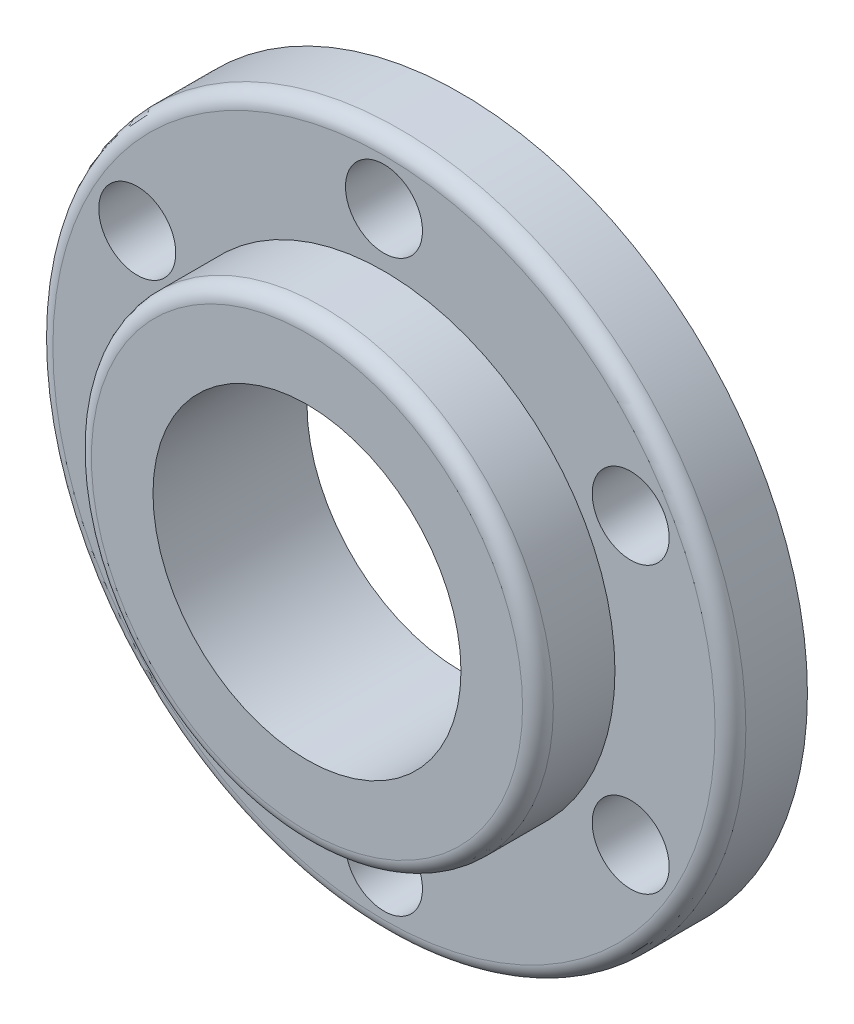
ISO-10303-21;
HEADER;
FILE_DESCRIPTION(('STEP AP214'),'2;1');
FILE_NAME('part.step','',(''),(''),'','','');
FILE_SCHEMA(('AUTOMOTIVE_DESIGN { 1 0 10303 214 1 1 1 1 }'));
ENDSEC;
DATA;
#1=APPLICATION_CONTEXT('core data for automotive mechanical design processes');
#2=APPLICATION_PROTOCOL_DEFINITION('international standard','automotive_design',2000,#1);
#3=PRODUCT_CONTEXT('',#1,'mechanical');
#4=PRODUCT('Part','Part','',(#3));
#5=PRODUCT_RELATED_PRODUCT_CATEGORY('part','',(#4));
#6=PRODUCT_DEFINITION_FORMATION('','',#4);
#7=PRODUCT_DEFINITION_CONTEXT('part definition',#1,'design');
#8=PRODUCT_DEFINITION('design','',#6,#7);
#9=PRODUCT_DEFINITION_SHAPE('','',#8);
#10=(LENGTH_UNIT() NAMED_UNIT(*) SI_UNIT(.MILLI.,.METRE.));
#11=(NAMED_UNIT(*) PLANE_ANGLE_UNIT() SI_UNIT($,.RADIAN.));
#12=(NAMED_UNIT(*) SI_UNIT($,.STERADIAN.) SOLID_ANGLE_UNIT());
#13=UNCERTAINTY_MEASURE_WITH_UNIT(LENGTH_MEASURE(1.E-05),#10,'distance_accuracy_value','');
#14=(GEOMETRIC_REPRESENTATION_CONTEXT(3) GLOBAL_UNCERTAINTY_ASSIGNED_CONTEXT((#13)) GLOBAL_UNIT_ASSIGNED_CONTEXT((#10,
#11,#12)) REPRESENTATION_CONTEXT('',''));
#15=CARTESIAN_POINT('',(0.,0.,0.));
#16=DIRECTION('',(0.,0.,1.));
#17=DIRECTION('',(1.,0.,0.));
#18=AXIS2_PLACEMENT_3D('',#15,#16,#17);
#19=CARTESIAN_POINT('',(0.,4.99740259740259,7.83134498552466));
#20=DIRECTION('',(0.,0.,-1.));
#21=DIRECTION('',(-1.,0.,0.));
#22=AXIS2_PLACEMENT_3D('',#19,#20,#21);
#23=CYLINDRICAL_SURFACE('',#22,0.675324675324676);
#24=CARTESIAN_POINT('',(0.,4.99740259740259,7.83134498552466));
#25=DIRECTION('',(0.,0.,1.));
#26=DIRECTION('',(1.,0.,0.));
#27=AXIS2_PLACEMENT_3D('',#24,#25,#26);
#28=CIRCLE('',#27,0.675324675324676);
#29=CARTESIAN_POINT('',(0.675324675324677,4.99740259740259,7.83134498552466));
#30=VERTEX_POINT('',#29);
#31=EDGE_CURVE('E60',#30,#30,#28,.T.);
#32=ORIENTED_EDGE('',*,*,#31,.T.);
#33=EDGE_LOOP('',(#32));
#34=FACE_BOUND('',#33,.T.);
#35=CARTESIAN_POINT('',(0.,4.99740259740259,6.48069563487531));
#36=DIRECTION('',(0.,0.,1.));
#37=DIRECTION('',(1.,0.,0.));
#38=AXIS2_PLACEMENT_3D('',#35,#36,#37);
#39=CIRCLE('',#38,0.675324675324676);
#40=CARTESIAN_POINT('',(0.675324675324677,4.99740259740259,6.48069563487531));
#41=VERTEX_POINT('',#40);
#42=EDGE_CURVE('E66',#41,#41,#39,.T.);
#43=ORIENTED_EDGE('',*,*,#42,.F.);
#44=EDGE_LOOP('',(#43));
#45=FACE_BOUND('',#44,.T.);
#46=ADVANCED_FACE('F36',(#34,#45),#23,.F.);
#47=CARTESIAN_POINT('',(4.327877602289,2.49870129870129,7.83134498552466));
#48=DIRECTION('',(0.,0.,-1.));
#49=DIRECTION('',(-1.,0.,0.));
#50=AXIS2_PLACEMENT_3D('',#47,#48,#49);
#51=CYLINDRICAL_SURFACE('',#50,0.675324675324675);
#52=CARTESIAN_POINT('',(4.327877602289,2.49870129870129,7.83134498552466));
#53=DIRECTION('',(0.,0.,1.));
#54=DIRECTION('',(1.,0.,0.));
#55=AXIS2_PLACEMENT_3D('',#52,#53,#54);
#56=CIRCLE('',#55,0.675324675324675);
#57=CARTESIAN_POINT('',(5.00320227761367,2.49870129870129,7.83134498552466));
#58=VERTEX_POINT('',#57);
#59=EDGE_CURVE('E94',#58,#58,#56,.T.);
#60=ORIENTED_EDGE('',*,*,#59,.T.);
#61=EDGE_LOOP('',(#60));
#62=FACE_BOUND('',#61,.T.);
#63=CARTESIAN_POINT('',(4.327877602289,2.49870129870129,6.48069563487531));
#64=DIRECTION('',(0.,0.,1.));
#65=DIRECTION('',(1.,0.,0.));
#66=AXIS2_PLACEMENT_3D('',#63,#64,#65);
#67=CIRCLE('',#66,0.675324675324675);
#68=CARTESIAN_POINT('',(5.00320227761367,2.49870129870129,6.48069563487531));
#69=VERTEX_POINT('',#68);
#70=EDGE_CURVE('E70',#69,#69,#67,.T.);
#71=ORIENTED_EDGE('',*,*,#70,.F.);
#72=EDGE_LOOP('',(#71));
#73=FACE_BOUND('',#72,.T.);
#74=ADVANCED_FACE('F140',(#62,#73),#51,.F.);
#75=CARTESIAN_POINT('',(4.32787760228898,-2.49870129870132,7.83134498552466));
#76=DIRECTION('',(0.,0.,-1.));
#77=DIRECTION('',(-1.,0.,0.));
#78=AXIS2_PLACEMENT_3D('',#75,#76,#77);
#79=CYLINDRICAL_SURFACE('',#78,0.675324675324676);
#80=CARTESIAN_POINT('',(4.32787760228898,-2.49870129870132,7.83134498552466));
#81=DIRECTION('',(0.,0.,1.));
#82=DIRECTION('',(1.,0.,0.));
#83=AXIS2_PLACEMENT_3D('',#80,#81,#82);
#84=CIRCLE('',#83,0.675324675324676);
#85=CARTESIAN_POINT('',(5.00320227761365,-2.49870129870132,7.83134498552466));
#86=VERTEX_POINT('',#85);
#87=EDGE_CURVE('E98',#86,#86,#84,.T.);
#88=ORIENTED_EDGE('',*,*,#87,.T.);
#89=EDGE_LOOP('',(#88));
#90=FACE_BOUND('',#89,.T.);
#91=CARTESIAN_POINT('',(4.32787760228898,-2.49870129870132,6.48069563487531));
#92=DIRECTION('',(0.,0.,1.));
#93=DIRECTION('',(1.,0.,0.));
#94=AXIS2_PLACEMENT_3D('',#91,#92,#93);
#95=CIRCLE('',#94,0.675324675324676);
#96=CARTESIAN_POINT('',(5.00320227761365,-2.49870129870132,6.48069563487531));
#97=VERTEX_POINT('',#96);
#98=EDGE_CURVE('E74',#97,#97,#95,.T.);
#99=ORIENTED_EDGE('',*,*,#98,.F.);
#100=EDGE_LOOP('',(#99));
#101=FACE_BOUND('',#100,.T.);
#102=ADVANCED_FACE('F146',(#90,#101),#79,.F.);
#103=CARTESIAN_POINT('',(0.,-4.9974025974026,7.83134498552466));
#104=DIRECTION('',(0.,0.,-1.));
#105=DIRECTION('',(-1.,0.,0.));
#106=AXIS2_PLACEMENT_3D('',#103,#104,#105);
#107=CYLINDRICAL_SURFACE('',#106,0.675324675324675);
#108=CARTESIAN_POINT('',(0.,-4.9974025974026,7.83134498552466));
#109=DIRECTION('',(0.,0.,1.));
#110=DIRECTION('',(1.,0.,0.));
#111=AXIS2_PLACEMENT_3D('',#108,#109,#110);
#112=CIRCLE('',#111,0.675324675324675);
#113=CARTESIAN_POINT('',(0.675324675324641,-4.9974025974026,7.83134498552466));
#114=VERTEX_POINT('',#113);
#115=EDGE_CURVE('E102',#114,#114,#112,.T.);
#116=ORIENTED_EDGE('',*,*,#115,.T.);
#117=EDGE_LOOP('',(#116));
#118=FACE_BOUND('',#117,.T.);
#119=CARTESIAN_POINT('',(0.,-4.9974025974026,6.48069563487531));
#120=DIRECTION('',(0.,0.,1.));
#121=DIRECTION('',(1.,0.,0.));
#122=AXIS2_PLACEMENT_3D('',#119,#120,#121);
#123=CIRCLE('',#122,0.675324675324675);
#124=CARTESIAN_POINT('',(0.675324675324641,-4.9974025974026,6.48069563487531));
#125=VERTEX_POINT('',#124);
#126=EDGE_CURVE('E78',#125,#125,#123,.T.);
#127=ORIENTED_EDGE('',*,*,#126,.F.);
#128=EDGE_LOOP('',(#127));
#129=FACE_BOUND('',#128,.T.);
#130=ADVANCED_FACE('F156',(#118,#129),#107,.F.);
#131=CARTESIAN_POINT('',(-4.32787760228901,-2.49870129870126,7.83134498552466));
#132=DIRECTION('',(0.,0.,-1.));
#133=DIRECTION('',(-1.,0.,0.));
#134=AXIS2_PLACEMENT_3D('',#131,#132,#133);
#135=CYLINDRICAL_SURFACE('',#134,0.675324675324675);
#136=CARTESIAN_POINT('',(-4.32787760228901,-2.49870129870126,7.83134498552466));
#137=DIRECTION('',(0.,0.,1.));
#138=DIRECTION('',(1.,0.,0.));
#139=AXIS2_PLACEMENT_3D('',#136,#137,#138);
#140=CIRCLE('',#139,0.675324675324675);
#141=CARTESIAN_POINT('',(-3.65255292696434,-2.49870129870126,7.83134498552466));
#142=VERTEX_POINT('',#141);
#143=EDGE_CURVE('E106',#142,#142,#140,.T.);
#144=ORIENTED_EDGE('',*,*,#143,.T.);
#145=EDGE_LOOP('',(#144));
#146=FACE_BOUND('',#145,.T.);
#147=CARTESIAN_POINT('',(-4.32787760228901,-2.49870129870126,6.48069563487531));
#148=DIRECTION('',(0.,0.,1.));
#149=DIRECTION('',(1.,0.,0.));
#150=AXIS2_PLACEMENT_3D('',#147,#148,#149);
#151=CIRCLE('',#150,0.675324675324675);
#152=CARTESIAN_POINT('',(-3.65255292696434,-2.49870129870126,6.48069563487531));
#153=VERTEX_POINT('',#152);
#154=EDGE_CURVE('E82',#153,#153,#151,.T.);
#155=ORIENTED_EDGE('',*,*,#154,.F.);
#156=EDGE_LOOP('',(#155));
#157=FACE_BOUND('',#156,.T.);
#158=ADVANCED_FACE('F160',(#146,#157),#135,.F.);
#159=CARTESIAN_POINT('',(-4.32787760228896,2.49870129870134,7.83134498552466));
#160=DIRECTION('',(0.,0.,-1.));
#161=DIRECTION('',(-1.,0.,0.));
#162=AXIS2_PLACEMENT_3D('',#159,#160,#161);
#163=CYLINDRICAL_SURFACE('',#162,0.675324675324675);
#164=CARTESIAN_POINT('',(-4.32787760228896,2.49870129870134,7.83134498552466));
#165=DIRECTION('',(0.,0.,1.));
#166=DIRECTION('',(1.,0.,0.));
#167=AXIS2_PLACEMENT_3D('',#164,#165,#166);
#168=CIRCLE('',#167,0.675324675324675);
#169=CARTESIAN_POINT('',(-3.65255292696428,2.49870129870134,7.83134498552466));
#170=VERTEX_POINT('',#169);
#171=EDGE_CURVE('E110',#170,#170,#168,.T.);
#172=ORIENTED_EDGE('',*,*,#171,.T.);
#173=EDGE_LOOP('',(#172));
#174=FACE_BOUND('',#173,.T.);
#175=CARTESIAN_POINT('',(-4.32787760228896,2.49870129870134,6.48069563487531));
#176=DIRECTION('',(0.,0.,1.));
#177=DIRECTION('',(1.,0.,0.));
#178=AXIS2_PLACEMENT_3D('',#175,#176,#177);
#179=CIRCLE('',#178,0.675324675324675);
#180=CARTESIAN_POINT('',(-3.65255292696428,2.49870129870134,6.48069563487531));
#181=VERTEX_POINT('',#180);
#182=EDGE_CURVE('E86',#181,#181,#179,.T.);
#183=ORIENTED_EDGE('',*,*,#182,.F.);
#184=EDGE_LOOP('',(#183));
#185=FACE_BOUND('',#184,.T.);
#186=ADVANCED_FACE('F164',(#174,#185),#163,.F.);
#187=CARTESIAN_POINT('',(0.,0.,7.83134498552466));
#188=DIRECTION('',(0.,0.,-1.));
#189=DIRECTION('',(-1.,0.,0.));
#190=AXIS2_PLACEMENT_3D('',#187,#188,#189);
#191=CYLINDRICAL_SURFACE('',#190,6.07792207792208);
#192=CARTESIAN_POINT('',(0.,0.,7.56121511539479));
#193=DIRECTION('',(0.,0.,1.));
#194=DIRECTION('',(1.,0.,0.));
#195=AXIS2_PLACEMENT_3D('',#192,#193,#194);
#196=CIRCLE('',#195,6.07792207792208);
#197=CARTESIAN_POINT('',(6.07792207792208,0.,7.56121511539479));
#198=VERTEX_POINT('',#197);
#199=EDGE_CURVE('E49',#198,#198,#196,.F.);
#200=ORIENTED_EDGE('',*,*,#199,.T.);
#201=EDGE_LOOP('',(#200));
#202=FACE_BOUND('',#201,.T.);
#203=CARTESIAN_POINT('',(0.,0.,6.48069563487531));
#204=DIRECTION('',(0.,0.,1.));
#205=DIRECTION('',(1.,0.,0.));
#206=AXIS2_PLACEMENT_3D('',#203,#204,#205);
#207=CIRCLE('',#206,6.07792207792208);
#208=CARTESIAN_POINT('',(6.07792207792208,0.,6.48069563487531));
#209=VERTEX_POINT('',#208);
#210=EDGE_CURVE('E61',#209,#209,#207,.T.);
#211=ORIENTED_EDGE('',*,*,#210,.T.);
#212=EDGE_LOOP('',(#211));
#213=FACE_BOUND('',#212,.T.);
#214=ADVANCED_FACE('F151',(#202,#213),#191,.T.);
#215=CARTESIAN_POINT('',(0.,0.,7.83134498552466));
#216=DIRECTION('',(0.,0.,1.));
#217=DIRECTION('',(1.,0.,0.));
#218=AXIS2_PLACEMENT_3D('',#215,#216,#217);
#219=PLANE('',#218);
#220=CARTESIAN_POINT('',(0.,0.,7.83134498552466));
#221=DIRECTION('',(0.,0.,1.));
#222=DIRECTION('',(1.,0.,0.));
#223=AXIS2_PLACEMENT_3D('',#220,#221,#222);
#224=CIRCLE('',#223,5.80779220779221);
#225=CARTESIAN_POINT('',(5.80779220779221,0.,7.83134498552466));
#226=VERTEX_POINT('',#225);
#227=EDGE_CURVE('E54',#226,#226,#224,.T.);
#228=ORIENTED_EDGE('',*,*,#227,.T.);
#229=EDGE_LOOP('',(#228));
#230=FACE_BOUND('',#229,.T.);
#231=CARTESIAN_POINT('',(0.,0.,7.83134498552466));
#232=DIRECTION('',(0.,0.,1.));
#233=DIRECTION('',(1.,0.,0.));
#234=AXIS2_PLACEMENT_3D('',#231,#232,#233);
#235=CIRCLE('',#234,4.05194805194805);
#236=CARTESIAN_POINT('',(4.05194805194805,0.,7.83134498552466));
#237=VERTEX_POINT('',#236);
#238=EDGE_CURVE('E65',#237,#237,#235,.T.);
#239=ORIENTED_EDGE('',*,*,#238,.F.);
#240=EDGE_LOOP('',(#239));
#241=FACE_BOUND('',#240,.T.);
#242=ORIENTED_EDGE('',*,*,#171,.F.);
#243=EDGE_LOOP('',(#242));
#244=FACE_BOUND('',#243,.T.);
#245=ORIENTED_EDGE('',*,*,#143,.F.);
#246=EDGE_LOOP('',(#245));
#247=FACE_BOUND('',#246,.T.);
#248=ORIENTED_EDGE('',*,*,#115,.F.);
#249=EDGE_LOOP('',(#248));
#250=FACE_BOUND('',#249,.T.);
#251=ORIENTED_EDGE('',*,*,#87,.F.);
#252=EDGE_LOOP('',(#251));
#253=FACE_BOUND('',#252,.T.);
#254=ORIENTED_EDGE('',*,*,#59,.F.);
#255=EDGE_LOOP('',(#254));
#256=FACE_BOUND('',#255,.T.);
#257=ORIENTED_EDGE('',*,*,#31,.F.);
#258=EDGE_LOOP('',(#257));
#259=FACE_BOUND('',#258,.T.);
#260=ADVANCED_FACE('F171',(#230,#241,#244,#247,#250,#253,#256,#259),#219,.T.);
#261=CARTESIAN_POINT('',(0.,0.,6.48069563487531));
#262=DIRECTION('',(0.,0.,1.));
#263=DIRECTION('',(1.,0.,0.));
#264=AXIS2_PLACEMENT_3D('',#261,#262,#263);
#265=PLANE('',#264);
#266=ORIENTED_EDGE('',*,*,#182,.T.);
#267=EDGE_LOOP('',(#266));
#268=FACE_BOUND('',#267,.T.);
#269=ORIENTED_EDGE('',*,*,#154,.T.);
#270=EDGE_LOOP('',(#269));
#271=FACE_BOUND('',#270,.T.);
#272=ORIENTED_EDGE('',*,*,#126,.T.);
#273=EDGE_LOOP('',(#272));
#274=FACE_BOUND('',#273,.T.);
#275=ORIENTED_EDGE('',*,*,#98,.T.);
#276=EDGE_LOOP('',(#275));
#277=FACE_BOUND('',#276,.T.);
#278=ORIENTED_EDGE('',*,*,#70,.T.);
#279=EDGE_LOOP('',(#278));
#280=FACE_BOUND('',#279,.T.);
#281=ORIENTED_EDGE('',*,*,#42,.T.);
#282=EDGE_LOOP('',(#281));
#283=FACE_BOUND('',#282,.T.);
#284=ORIENTED_EDGE('',*,*,#210,.F.);
#285=EDGE_LOOP('',(#284));
#286=FACE_BOUND('',#285,.T.);
#287=CARTESIAN_POINT('',(0.,0.,6.48069563487531));
#288=DIRECTION('',(0.,0.,1.));
#289=DIRECTION('',(1.,0.,0.));
#290=AXIS2_PLACEMENT_3D('',#287,#288,#289);
#291=CIRCLE('',#290,2.7012987012987);
#292=CARTESIAN_POINT('',(2.7012987012987,0.,6.48069563487531));
#293=VERTEX_POINT('',#292);
#294=EDGE_CURVE('E117',#293,#293,#291,.T.);
#295=ORIENTED_EDGE('',*,*,#294,.T.);
#296=EDGE_LOOP('',(#295));
#297=FACE_BOUND('',#296,.T.);
#298=ADVANCED_FACE('F177',(#268,#271,#274,#277,#280,#283,#286,#297),#265,.F.);
#299=CARTESIAN_POINT('',(0.,0.,9.18199433617401));
#300=DIRECTION('',(0.,0.,-1.));
#301=DIRECTION('',(-1.,0.,0.));
#302=AXIS2_PLACEMENT_3D('',#299,#300,#301);
#303=CYLINDRICAL_SURFACE('',#302,2.7012987012987);
#304=CARTESIAN_POINT('',(0.,0.,9.18199433617401));
#305=DIRECTION('',(0.,0.,1.));
#306=DIRECTION('',(1.,0.,0.));
#307=AXIS2_PLACEMENT_3D('',#304,#305,#306);
#308=CIRCLE('',#307,2.7012987012987);
#309=CARTESIAN_POINT('',(2.7012987012987,0.,9.18199433617401));
#310=VERTEX_POINT('',#309);
#311=EDGE_CURVE('E90',#310,#310,#308,.T.);
#312=ORIENTED_EDGE('',*,*,#311,.T.);
#313=EDGE_LOOP('',(#312));
#314=FACE_BOUND('',#313,.T.);
#315=ORIENTED_EDGE('',*,*,#294,.F.);
#316=EDGE_LOOP('',(#315));
#317=FACE_BOUND('',#316,.T.);
#318=ADVANCED_FACE('F125',(#314,#317),#303,.F.);
#319=CARTESIAN_POINT('',(0.,0.,9.18199433617401));
#320=DIRECTION('',(0.,0.,-1.));
#321=DIRECTION('',(-1.,0.,0.));
#322=AXIS2_PLACEMENT_3D('',#319,#320,#321);
#323=CYLINDRICAL_SURFACE('',#322,4.05194805194805);
#324=CARTESIAN_POINT('',(0.,0.,8.91186446604415));
#325=DIRECTION('',(0.,0.,1.));
#326=DIRECTION('',(1.,0.,0.));
#327=AXIS2_PLACEMENT_3D('',#324,#325,#326);
#328=CIRCLE('',#327,4.05194805194805);
#329=CARTESIAN_POINT('',(4.05194805194805,0.,8.91186446604415));
#330=VERTEX_POINT('',#329);
#331=EDGE_CURVE('E10',#330,#330,#328,.F.);
#332=ORIENTED_EDGE('',*,*,#331,.T.);
#333=EDGE_LOOP('',(#332));
#334=FACE_BOUND('',#333,.T.);
#335=ORIENTED_EDGE('',*,*,#238,.T.);
#336=EDGE_LOOP('',(#335));
#337=FACE_BOUND('',#336,.T.);
#338=ADVANCED_FACE('F131',(#334,#337),#323,.T.);
#339=CARTESIAN_POINT('',(0.,0.,9.18199433617401));
#340=DIRECTION('',(0.,0.,1.));
#341=DIRECTION('',(1.,0.,0.));
#342=AXIS2_PLACEMENT_3D('',#339,#340,#341);
#343=PLANE('',#342);
#344=CARTESIAN_POINT('',(0.,0.,9.18199433617401));
#345=DIRECTION('',(0.,0.,1.));
#346=DIRECTION('',(1.,0.,0.));
#347=AXIS2_PLACEMENT_3D('',#344,#345,#346);
#348=CIRCLE('',#347,3.78181818181818);
#349=CARTESIAN_POINT('',(3.78181818181818,0.,9.18199433617401));
#350=VERTEX_POINT('',#349);
#351=EDGE_CURVE('E44',#350,#350,#348,.T.);
#352=ORIENTED_EDGE('',*,*,#351,.T.);
#353=EDGE_LOOP('',(#352));
#354=FACE_BOUND('',#353,.T.);
#355=ORIENTED_EDGE('',*,*,#311,.F.);
#356=EDGE_LOOP('',(#355));
#357=FACE_BOUND('',#356,.T.);
#358=ADVANCED_FACE('F128',(#354,#357),#343,.T.);
#359=CARTESIAN_POINT('',(0.,0.,7.56121511539479));
#360=DIRECTION('',(0.,0.,1.));
#361=DIRECTION('',(1.,0.,0.));
#362=AXIS2_PLACEMENT_3D('',#359,#360,#361);
#363=TOROIDAL_SURFACE('',#362,5.80779220779221,0.27012987012987);
#364=ORIENTED_EDGE('',*,*,#199,.F.);
#365=EDGE_LOOP('',(#364));
#366=FACE_BOUND('',#365,.T.);
#367=ORIENTED_EDGE('',*,*,#227,.F.);
#368=EDGE_LOOP('',(#367));
#369=FACE_BOUND('',#368,.T.);
#370=ADVANCED_FACE('F130',(#366,#369),#363,.T.);
#371=CARTESIAN_POINT('',(0.,0.,8.91186446604415));
#372=DIRECTION('',(0.,0.,1.));
#373=DIRECTION('',(1.,0.,0.));
#374=AXIS2_PLACEMENT_3D('',#371,#372,#373);
#375=TOROIDAL_SURFACE('',#374,3.78181818181818,0.27012987012987);
#376=ORIENTED_EDGE('',*,*,#331,.F.);
#377=EDGE_LOOP('',(#376));
#378=FACE_BOUND('',#377,.T.);
#379=ORIENTED_EDGE('',*,*,#351,.F.);
#380=EDGE_LOOP('',(#379));
#381=FACE_BOUND('',#380,.T.);
#382=ADVANCED_FACE('F38',(#378,#381),#375,.T.);
#383=CLOSED_SHELL('',(#46,#74,#102,#130,#158,#186,#214,#260,#298,#318,#338,#358,#370,#382));
#384=MANIFOLD_SOLID_BREP('B2',#383);
#385=ADVANCED_BREP_SHAPE_REPRESENTATION('',(#18,#384),#14);
#386=SHAPE_DEFINITION_REPRESENTATION(#9,#385);
ENDSEC;
END-ISO-10303-21;
